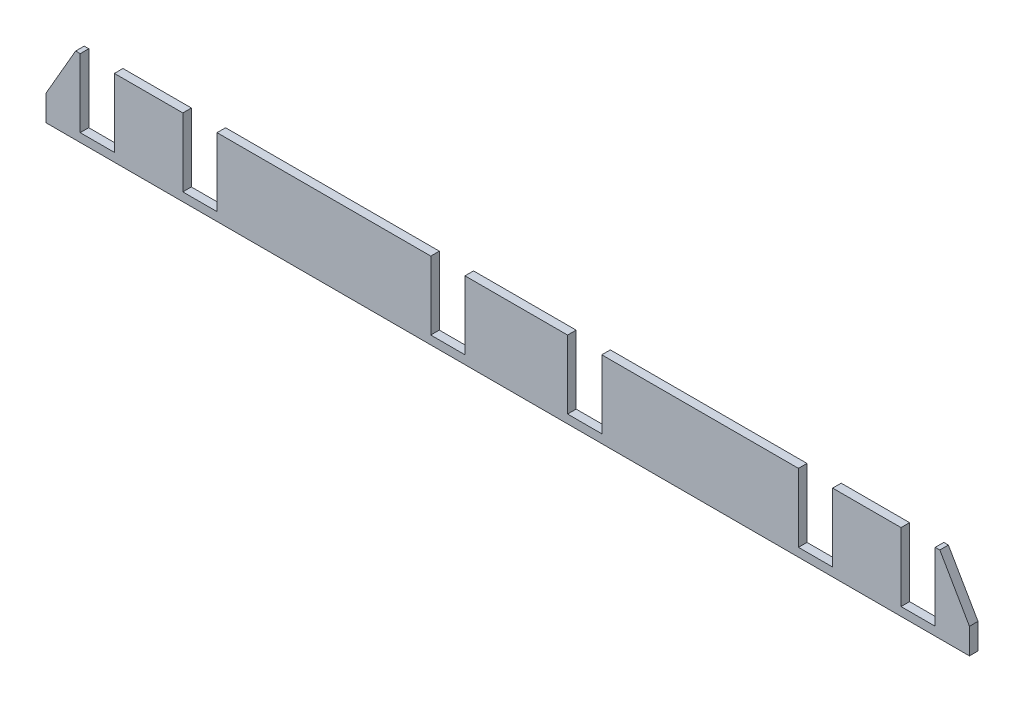
ISO-10303-21;
HEADER;
FILE_DESCRIPTION(('STEP AP214'),'2;1');
FILE_NAME('part.step','',(''),(''),'','','');
FILE_SCHEMA(('AUTOMOTIVE_DESIGN { 1 0 10303 214 1 1 1 1 }'));
ENDSEC;
DATA;
#1=APPLICATION_CONTEXT('core data for automotive mechanical design processes');
#2=APPLICATION_PROTOCOL_DEFINITION('international standard','automotive_design',2000,#1);
#3=PRODUCT_CONTEXT('',#1,'mechanical');
#4=PRODUCT('Part','Part','',(#3));
#5=PRODUCT_RELATED_PRODUCT_CATEGORY('part','',(#4));
#6=PRODUCT_DEFINITION_FORMATION('','',#4);
#7=PRODUCT_DEFINITION_CONTEXT('part definition',#1,'design');
#8=PRODUCT_DEFINITION('design','',#6,#7);
#9=PRODUCT_DEFINITION_SHAPE('','',#8);
#10=(LENGTH_UNIT() NAMED_UNIT(*) SI_UNIT(.MILLI.,.METRE.));
#11=(NAMED_UNIT(*) PLANE_ANGLE_UNIT() SI_UNIT($,.RADIAN.));
#12=(NAMED_UNIT(*) SI_UNIT($,.STERADIAN.) SOLID_ANGLE_UNIT());
#13=UNCERTAINTY_MEASURE_WITH_UNIT(LENGTH_MEASURE(1.E-05),#10,'distance_accuracy_value','');
#14=(GEOMETRIC_REPRESENTATION_CONTEXT(3) GLOBAL_UNCERTAINTY_ASSIGNED_CONTEXT((#13)) GLOBAL_UNIT_ASSIGNED_CONTEXT((#10,
#11,#12)) REPRESENTATION_CONTEXT('',''));
#15=CARTESIAN_POINT('',(0.,0.,0.));
#16=DIRECTION('',(0.,0.,1.));
#17=DIRECTION('',(1.,0.,0.));
#18=AXIS2_PLACEMENT_3D('',#15,#16,#17);
#19=CARTESIAN_POINT('',(0.,0.,10.));
#20=DIRECTION('',(1.,0.,0.));
#21=DIRECTION('',(0.,0.,-1.));
#22=AXIS2_PLACEMENT_3D('',#19,#20,#21);
#23=PLANE('',#22);
#24=DIRECTION('',(0.,-1.,0.));
#25=VECTOR('',#24,1.);
#26=CARTESIAN_POINT('',(0.,0.,10.));
#27=LINE('',#26,#25);
#28=CARTESIAN_POINT('',(0.,29.9999999999996,10.));
#29=VERTEX_POINT('',#28);
#30=CARTESIAN_POINT('',(0.,0.,10.));
#31=VERTEX_POINT('',#30);
#32=EDGE_CURVE('E228',#29,#31,#27,.T.);
#33=ORIENTED_EDGE('',*,*,#32,.F.);
#34=DIRECTION('',(0.,0.,-1.));
#35=VECTOR('',#34,1.);
#36=CARTESIAN_POINT('',(0.,29.9999999999996,10.));
#37=LINE('',#36,#35);
#38=CARTESIAN_POINT('',(0.,29.9999999999996,0.));
#39=VERTEX_POINT('',#38);
#40=EDGE_CURVE('E253',#29,#39,#37,.T.);
#41=ORIENTED_EDGE('',*,*,#40,.T.);
#42=DIRECTION('',(0.,-1.,0.));
#43=VECTOR('',#42,1.);
#44=CARTESIAN_POINT('',(0.,0.,0.));
#45=LINE('',#44,#43);
#46=CARTESIAN_POINT('',(0.,0.,0.));
#47=VERTEX_POINT('',#46);
#48=EDGE_CURVE('E251',#39,#47,#45,.T.);
#49=ORIENTED_EDGE('',*,*,#48,.T.);
#50=DIRECTION('',(0.,0.,-1.));
#51=VECTOR('',#50,1.);
#52=CARTESIAN_POINT('',(0.,0.,10.));
#53=LINE('',#52,#51);
#54=EDGE_CURVE('E245',#31,#47,#53,.T.);
#55=ORIENTED_EDGE('',*,*,#54,.F.);
#56=EDGE_LOOP('',(#33,#41,#49,#55));
#57=FACE_BOUND('',#56,.T.);
#58=ADVANCED_FACE('F33',(#57),#23,.F.);
#59=CARTESIAN_POINT('',(0.,0.,10.));
#60=DIRECTION('',(0.,1.,0.));
#61=DIRECTION('',(0.,0.,1.));
#62=AXIS2_PLACEMENT_3D('',#59,#60,#61);
#63=PLANE('',#62);
#64=DIRECTION('',(1.,0.,0.));
#65=VECTOR('',#64,1.);
#66=CARTESIAN_POINT('',(0.,0.,0.));
#67=LINE('',#66,#65);
#68=CARTESIAN_POINT('',(1080.,0.,0.));
#69=VERTEX_POINT('',#68);
#70=EDGE_CURVE('E287',#47,#69,#67,.T.);
#71=ORIENTED_EDGE('',*,*,#70,.T.);
#72=DIRECTION('',(0.,0.,-1.));
#73=VECTOR('',#72,1.);
#74=CARTESIAN_POINT('',(1080.,0.,10.));
#75=LINE('',#74,#73);
#76=CARTESIAN_POINT('',(1080.,0.,10.));
#77=VERTEX_POINT('',#76);
#78=EDGE_CURVE('E247',#77,#69,#75,.T.);
#79=ORIENTED_EDGE('',*,*,#78,.F.);
#80=DIRECTION('',(1.,0.,0.));
#81=VECTOR('',#80,1.);
#82=CARTESIAN_POINT('',(0.,0.,10.));
#83=LINE('',#82,#81);
#84=EDGE_CURVE('E232',#31,#77,#83,.T.);
#85=ORIENTED_EDGE('',*,*,#84,.F.);
#86=ORIENTED_EDGE('',*,*,#54,.T.);
#87=EDGE_LOOP('',(#71,#79,#85,#86));
#88=FACE_BOUND('',#87,.T.);
#89=ADVANCED_FACE('F244',(#88),#63,.F.);
#90=CARTESIAN_POINT('',(1080.,0.,10.));
#91=DIRECTION('',(-1.,0.,0.));
#92=DIRECTION('',(0.,0.,1.));
#93=AXIS2_PLACEMENT_3D('',#90,#91,#92);
#94=PLANE('',#93);
#95=DIRECTION('',(0.,1.,0.));
#96=VECTOR('',#95,1.);
#97=CARTESIAN_POINT('',(1080.,0.,0.));
#98=LINE('',#97,#96);
#99=CARTESIAN_POINT('',(1080.,29.9999999999995,0.));
#100=VERTEX_POINT('',#99);
#101=EDGE_CURVE('E283',#69,#100,#98,.T.);
#102=ORIENTED_EDGE('',*,*,#101,.T.);
#103=DIRECTION('',(0.,0.,1.));
#104=VECTOR('',#103,1.);
#105=CARTESIAN_POINT('',(1080.,29.9999999999995,10.));
#106=LINE('',#105,#104);
#107=CARTESIAN_POINT('',(1080.,29.9999999999995,10.));
#108=VERTEX_POINT('',#107);
#109=EDGE_CURVE('E11',#100,#108,#106,.T.);
#110=ORIENTED_EDGE('',*,*,#109,.T.);
#111=DIRECTION('',(0.,1.,0.));
#112=VECTOR('',#111,1.);
#113=CARTESIAN_POINT('',(1080.,0.,10.));
#114=LINE('',#113,#112);
#115=EDGE_CURVE('E248',#77,#108,#114,.T.);
#116=ORIENTED_EDGE('',*,*,#115,.F.);
#117=ORIENTED_EDGE('',*,*,#78,.T.);
#118=EDGE_LOOP('',(#102,#110,#116,#117));
#119=FACE_BOUND('',#118,.T.);
#120=ADVANCED_FACE('F460',(#119),#94,.F.);
#121=CARTESIAN_POINT('',(1040.,90.,10.));
#122=DIRECTION('',(0.,-1.,0.));
#123=DIRECTION('',(0.,0.,-1.));
#124=AXIS2_PLACEMENT_3D('',#121,#122,#123);
#125=PLANE('',#124);
#126=DIRECTION('',(-1.,0.,0.));
#127=VECTOR('',#126,1.);
#128=CARTESIAN_POINT('',(1040.,90.,10.));
#129=LINE('',#128,#127);
#130=CARTESIAN_POINT('',(1045.35898384862,90.,10.));
#131=VERTEX_POINT('',#130);
#132=CARTESIAN_POINT('',(1040.,90.,10.));
#133=VERTEX_POINT('',#132);
#134=EDGE_CURVE('E275',#131,#133,#129,.T.);
#135=ORIENTED_EDGE('',*,*,#134,.F.);
#136=DIRECTION('',(0.,0.,-1.));
#137=VECTOR('',#136,1.);
#138=CARTESIAN_POINT('',(1045.35898384862,90.,10.));
#139=LINE('',#138,#137);
#140=CARTESIAN_POINT('',(1045.35898384862,90.,0.));
#141=VERTEX_POINT('',#140);
#142=EDGE_CURVE('E41',#131,#141,#139,.T.);
#143=ORIENTED_EDGE('',*,*,#142,.T.);
#144=DIRECTION('',(-1.,0.,0.));
#145=VECTOR('',#144,1.);
#146=CARTESIAN_POINT('',(1040.,90.,0.));
#147=LINE('',#146,#145);
#148=CARTESIAN_POINT('',(1040.,90.,0.));
#149=VERTEX_POINT('',#148);
#150=EDGE_CURVE('E273',#141,#149,#147,.T.);
#151=ORIENTED_EDGE('',*,*,#150,.T.);
#152=DIRECTION('',(0.,0.,-1.));
#153=VECTOR('',#152,1.);
#154=CARTESIAN_POINT('',(1040.,90.,10.));
#155=LINE('',#154,#153);
#156=EDGE_CURVE('E257',#133,#149,#155,.T.);
#157=ORIENTED_EDGE('',*,*,#156,.F.);
#158=EDGE_LOOP('',(#135,#143,#151,#157));
#159=FACE_BOUND('',#158,.T.);
#160=ADVANCED_FACE('F271',(#159),#125,.F.);
#161=CARTESIAN_POINT('',(1040.,90.,10.));
#162=DIRECTION('',(1.,0.,0.));
#163=DIRECTION('',(0.,0.,-1.));
#164=AXIS2_PLACEMENT_3D('',#161,#162,#163);
#165=PLANE('',#164);
#166=DIRECTION('',(0.,-1.,0.));
#167=VECTOR('',#166,1.);
#168=CARTESIAN_POINT('',(1040.,90.,0.));
#169=LINE('',#168,#167);
#170=CARTESIAN_POINT('',(1040.,9.99999999999999,0.));
#171=VERTEX_POINT('',#170);
#172=EDGE_CURVE('E282',#149,#171,#169,.T.);
#173=ORIENTED_EDGE('',*,*,#172,.T.);
#174=DIRECTION('',(0.,0.,-1.));
#175=VECTOR('',#174,1.);
#176=CARTESIAN_POINT('',(1040.,9.99999999999999,10.));
#177=LINE('',#176,#175);
#178=CARTESIAN_POINT('',(1040.,9.99999999999999,10.));
#179=VERTEX_POINT('',#178);
#180=EDGE_CURVE('E403',#179,#171,#177,.T.);
#181=ORIENTED_EDGE('',*,*,#180,.F.);
#182=DIRECTION('',(0.,-1.,0.));
#183=VECTOR('',#182,1.);
#184=CARTESIAN_POINT('',(1040.,90.,10.));
#185=LINE('',#184,#183);
#186=EDGE_CURVE('E409',#133,#179,#185,.T.);
#187=ORIENTED_EDGE('',*,*,#186,.F.);
#188=ORIENTED_EDGE('',*,*,#156,.T.);
#189=EDGE_LOOP('',(#173,#181,#187,#188));
#190=FACE_BOUND('',#189,.T.);
#191=ADVANCED_FACE('F407',(#190),#165,.F.);
#192=CARTESIAN_POINT('',(1040.,9.99999999999999,10.));
#193=DIRECTION('',(0.,-1.,0.));
#194=DIRECTION('',(0.,0.,-1.));
#195=AXIS2_PLACEMENT_3D('',#192,#193,#194);
#196=PLANE('',#195);
#197=DIRECTION('',(-1.,0.,0.));
#198=VECTOR('',#197,1.);
#199=CARTESIAN_POINT('',(1040.,9.99999999999999,0.));
#200=LINE('',#199,#198);
#201=CARTESIAN_POINT('',(1000.,9.99999999999999,0.));
#202=VERTEX_POINT('',#201);
#203=EDGE_CURVE('E285',#171,#202,#200,.T.);
#204=ORIENTED_EDGE('',*,*,#203,.T.);
#205=DIRECTION('',(0.,0.,-1.));
#206=VECTOR('',#205,1.);
#207=CARTESIAN_POINT('',(1000.,9.99999999999999,10.));
#208=LINE('',#207,#206);
#209=CARTESIAN_POINT('',(1000.,9.99999999999999,10.));
#210=VERTEX_POINT('',#209);
#211=EDGE_CURVE('E400',#210,#202,#208,.T.);
#212=ORIENTED_EDGE('',*,*,#211,.F.);
#213=DIRECTION('',(-1.,0.,0.));
#214=VECTOR('',#213,1.);
#215=CARTESIAN_POINT('',(1040.,9.99999999999999,10.));
#216=LINE('',#215,#214);
#217=EDGE_CURVE('E411',#179,#210,#216,.T.);
#218=ORIENTED_EDGE('',*,*,#217,.F.);
#219=ORIENTED_EDGE('',*,*,#180,.T.);
#220=EDGE_LOOP('',(#204,#212,#218,#219));
#221=FACE_BOUND('',#220,.T.);
#222=ADVANCED_FACE('F480',(#221),#196,.F.);
#223=CARTESIAN_POINT('',(1000.,90.,10.));
#224=DIRECTION('',(-1.,0.,0.));
#225=DIRECTION('',(0.,0.,1.));
#226=AXIS2_PLACEMENT_3D('',#223,#224,#225);
#227=PLANE('',#226);
#228=DIRECTION('',(0.,1.,0.));
#229=VECTOR('',#228,1.);
#230=CARTESIAN_POINT('',(1000.,90.,0.));
#231=LINE('',#230,#229);
#232=CARTESIAN_POINT('',(1000.,90.,0.));
#233=VERTEX_POINT('',#232);
#234=EDGE_CURVE('E292',#202,#233,#231,.T.);
#235=ORIENTED_EDGE('',*,*,#234,.T.);
#236=DIRECTION('',(0.,0.,-1.));
#237=VECTOR('',#236,1.);
#238=CARTESIAN_POINT('',(1000.,90.,10.));
#239=LINE('',#238,#237);
#240=CARTESIAN_POINT('',(1000.,90.,10.));
#241=VERTEX_POINT('',#240);
#242=EDGE_CURVE('E397',#241,#233,#239,.T.);
#243=ORIENTED_EDGE('',*,*,#242,.F.);
#244=DIRECTION('',(0.,1.,0.));
#245=VECTOR('',#244,1.);
#246=CARTESIAN_POINT('',(1000.,90.,10.));
#247=LINE('',#246,#245);
#248=EDGE_CURVE('E413',#210,#241,#247,.T.);
#249=ORIENTED_EDGE('',*,*,#248,.F.);
#250=ORIENTED_EDGE('',*,*,#211,.T.);
#251=EDGE_LOOP('',(#235,#243,#249,#250));
#252=FACE_BOUND('',#251,.T.);
#253=ADVANCED_FACE('F483',(#252),#227,.F.);
#254=CARTESIAN_POINT('',(920.,90.,10.));
#255=DIRECTION('',(0.,-1.,0.));
#256=DIRECTION('',(0.,0.,-1.));
#257=AXIS2_PLACEMENT_3D('',#254,#255,#256);
#258=PLANE('',#257);
#259=DIRECTION('',(-1.,0.,0.));
#260=VECTOR('',#259,1.);
#261=CARTESIAN_POINT('',(920.,90.,0.));
#262=LINE('',#261,#260);
#263=CARTESIAN_POINT('',(920.,90.,0.));
#264=VERTEX_POINT('',#263);
#265=EDGE_CURVE('E294',#233,#264,#262,.T.);
#266=ORIENTED_EDGE('',*,*,#265,.T.);
#267=DIRECTION('',(0.,0.,-1.));
#268=VECTOR('',#267,1.);
#269=CARTESIAN_POINT('',(920.,90.,10.));
#270=LINE('',#269,#268);
#271=CARTESIAN_POINT('',(920.,90.,10.));
#272=VERTEX_POINT('',#271);
#273=EDGE_CURVE('E394',#272,#264,#270,.T.);
#274=ORIENTED_EDGE('',*,*,#273,.F.);
#275=DIRECTION('',(-1.,0.,0.));
#276=VECTOR('',#275,1.);
#277=CARTESIAN_POINT('',(920.,90.,10.));
#278=LINE('',#277,#276);
#279=EDGE_CURVE('E419',#241,#272,#278,.T.);
#280=ORIENTED_EDGE('',*,*,#279,.F.);
#281=ORIENTED_EDGE('',*,*,#242,.T.);
#282=EDGE_LOOP('',(#266,#274,#280,#281));
#283=FACE_BOUND('',#282,.T.);
#284=ADVANCED_FACE('F487',(#283),#258,.F.);
#285=CARTESIAN_POINT('',(920.,90.,10.));
#286=DIRECTION('',(1.,0.,0.));
#287=DIRECTION('',(0.,0.,-1.));
#288=AXIS2_PLACEMENT_3D('',#285,#286,#287);
#289=PLANE('',#288);
#290=DIRECTION('',(0.,-1.,0.));
#291=VECTOR('',#290,1.);
#292=CARTESIAN_POINT('',(920.,90.,0.));
#293=LINE('',#292,#291);
#294=CARTESIAN_POINT('',(920.,9.99999999999999,0.));
#295=VERTEX_POINT('',#294);
#296=EDGE_CURVE('E296',#264,#295,#293,.T.);
#297=ORIENTED_EDGE('',*,*,#296,.T.);
#298=DIRECTION('',(0.,0.,-1.));
#299=VECTOR('',#298,1.);
#300=CARTESIAN_POINT('',(920.,9.99999999999999,10.));
#301=LINE('',#300,#299);
#302=CARTESIAN_POINT('',(920.,9.99999999999999,10.));
#303=VERTEX_POINT('',#302);
#304=EDGE_CURVE('E391',#303,#295,#301,.T.);
#305=ORIENTED_EDGE('',*,*,#304,.F.);
#306=DIRECTION('',(0.,-1.,0.));
#307=VECTOR('',#306,1.);
#308=CARTESIAN_POINT('',(920.,90.,10.));
#309=LINE('',#308,#307);
#310=EDGE_CURVE('E421',#272,#303,#309,.T.);
#311=ORIENTED_EDGE('',*,*,#310,.F.);
#312=ORIENTED_EDGE('',*,*,#273,.T.);
#313=EDGE_LOOP('',(#297,#305,#311,#312));
#314=FACE_BOUND('',#313,.T.);
#315=ADVANCED_FACE('F491',(#314),#289,.F.);
#316=CARTESIAN_POINT('',(920.,9.99999999999999,10.));
#317=DIRECTION('',(0.,-1.,0.));
#318=DIRECTION('',(0.,0.,-1.));
#319=AXIS2_PLACEMENT_3D('',#316,#317,#318);
#320=PLANE('',#319);
#321=DIRECTION('',(-1.,0.,0.));
#322=VECTOR('',#321,1.);
#323=CARTESIAN_POINT('',(920.,9.99999999999999,0.));
#324=LINE('',#323,#322);
#325=CARTESIAN_POINT('',(880.,9.99999999999999,0.));
#326=VERTEX_POINT('',#325);
#327=EDGE_CURVE('E298',#295,#326,#324,.T.);
#328=ORIENTED_EDGE('',*,*,#327,.T.);
#329=DIRECTION('',(0.,0.,-1.));
#330=VECTOR('',#329,1.);
#331=CARTESIAN_POINT('',(880.,9.99999999999999,10.));
#332=LINE('',#331,#330);
#333=CARTESIAN_POINT('',(880.,9.99999999999999,10.));
#334=VERTEX_POINT('',#333);
#335=EDGE_CURVE('E388',#334,#326,#332,.T.);
#336=ORIENTED_EDGE('',*,*,#335,.F.);
#337=DIRECTION('',(-1.,0.,0.));
#338=VECTOR('',#337,1.);
#339=CARTESIAN_POINT('',(920.,9.99999999999999,10.));
#340=LINE('',#339,#338);
#341=EDGE_CURVE('E423',#303,#334,#340,.T.);
#342=ORIENTED_EDGE('',*,*,#341,.F.);
#343=ORIENTED_EDGE('',*,*,#304,.T.);
#344=EDGE_LOOP('',(#328,#336,#342,#343));
#345=FACE_BOUND('',#344,.T.);
#346=ADVANCED_FACE('F495',(#345),#320,.F.);
#347=CARTESIAN_POINT('',(880.,90.,10.));
#348=DIRECTION('',(-1.,0.,0.));
#349=DIRECTION('',(0.,0.,1.));
#350=AXIS2_PLACEMENT_3D('',#347,#348,#349);
#351=PLANE('',#350);
#352=DIRECTION('',(0.,1.,0.));
#353=VECTOR('',#352,1.);
#354=CARTESIAN_POINT('',(880.,90.,0.));
#355=LINE('',#354,#353);
#356=CARTESIAN_POINT('',(880.,90.,0.));
#357=VERTEX_POINT('',#356);
#358=EDGE_CURVE('E300',#326,#357,#355,.T.);
#359=ORIENTED_EDGE('',*,*,#358,.T.);
#360=DIRECTION('',(0.,0.,-1.));
#361=VECTOR('',#360,1.);
#362=CARTESIAN_POINT('',(880.,90.,10.));
#363=LINE('',#362,#361);
#364=CARTESIAN_POINT('',(880.,90.,10.));
#365=VERTEX_POINT('',#364);
#366=EDGE_CURVE('E385',#365,#357,#363,.T.);
#367=ORIENTED_EDGE('',*,*,#366,.F.);
#368=DIRECTION('',(0.,1.,0.));
#369=VECTOR('',#368,1.);
#370=CARTESIAN_POINT('',(880.,90.,10.));
#371=LINE('',#370,#369);
#372=EDGE_CURVE('E425',#334,#365,#371,.T.);
#373=ORIENTED_EDGE('',*,*,#372,.F.);
#374=ORIENTED_EDGE('',*,*,#335,.T.);
#375=EDGE_LOOP('',(#359,#367,#373,#374));
#376=FACE_BOUND('',#375,.T.);
#377=ADVANCED_FACE('F499',(#376),#351,.F.);
#378=CARTESIAN_POINT('',(880.,90.,10.));
#379=DIRECTION('',(0.,-1.,0.));
#380=DIRECTION('',(0.,0.,-1.));
#381=AXIS2_PLACEMENT_3D('',#378,#379,#380);
#382=PLANE('',#381);
#383=DIRECTION('',(-1.,0.,0.));
#384=VECTOR('',#383,1.);
#385=CARTESIAN_POINT('',(880.,90.,0.));
#386=LINE('',#385,#384);
#387=CARTESIAN_POINT('',(650.,90.,0.));
#388=VERTEX_POINT('',#387);
#389=EDGE_CURVE('E302',#357,#388,#386,.T.);
#390=ORIENTED_EDGE('',*,*,#389,.T.);
#391=DIRECTION('',(0.,0.,-1.));
#392=VECTOR('',#391,1.);
#393=CARTESIAN_POINT('',(650.,90.,10.));
#394=LINE('',#393,#392);
#395=CARTESIAN_POINT('',(650.,90.,10.));
#396=VERTEX_POINT('',#395);
#397=EDGE_CURVE('E382',#396,#388,#394,.T.);
#398=ORIENTED_EDGE('',*,*,#397,.F.);
#399=DIRECTION('',(-1.,0.,0.));
#400=VECTOR('',#399,1.);
#401=CARTESIAN_POINT('',(880.,90.,10.));
#402=LINE('',#401,#400);
#403=EDGE_CURVE('E427',#365,#396,#402,.T.);
#404=ORIENTED_EDGE('',*,*,#403,.F.);
#405=ORIENTED_EDGE('',*,*,#366,.T.);
#406=EDGE_LOOP('',(#390,#398,#404,#405));
#407=FACE_BOUND('',#406,.T.);
#408=ADVANCED_FACE('F503',(#407),#382,.F.);
#409=CARTESIAN_POINT('',(650.,90.,10.));
#410=DIRECTION('',(1.,0.,0.));
#411=DIRECTION('',(0.,0.,-1.));
#412=AXIS2_PLACEMENT_3D('',#409,#410,#411);
#413=PLANE('',#412);
#414=DIRECTION('',(0.,-1.,0.));
#415=VECTOR('',#414,1.);
#416=CARTESIAN_POINT('',(650.,90.,0.));
#417=LINE('',#416,#415);
#418=CARTESIAN_POINT('',(650.,9.99999999999999,0.));
#419=VERTEX_POINT('',#418);
#420=EDGE_CURVE('E304',#388,#419,#417,.T.);
#421=ORIENTED_EDGE('',*,*,#420,.T.);
#422=DIRECTION('',(0.,0.,-1.));
#423=VECTOR('',#422,1.);
#424=CARTESIAN_POINT('',(650.,9.99999999999999,10.));
#425=LINE('',#424,#423);
#426=CARTESIAN_POINT('',(650.,9.99999999999999,10.));
#427=VERTEX_POINT('',#426);
#428=EDGE_CURVE('E379',#427,#419,#425,.T.);
#429=ORIENTED_EDGE('',*,*,#428,.F.);
#430=DIRECTION('',(0.,-1.,0.));
#431=VECTOR('',#430,1.);
#432=CARTESIAN_POINT('',(650.,90.,10.));
#433=LINE('',#432,#431);
#434=EDGE_CURVE('E429',#396,#427,#433,.T.);
#435=ORIENTED_EDGE('',*,*,#434,.F.);
#436=ORIENTED_EDGE('',*,*,#397,.T.);
#437=EDGE_LOOP('',(#421,#429,#435,#436));
#438=FACE_BOUND('',#437,.T.);
#439=ADVANCED_FACE('F507',(#438),#413,.F.);
#440=CARTESIAN_POINT('',(610.,9.99999999999999,10.));
#441=DIRECTION('',(0.,-1.,0.));
#442=DIRECTION('',(0.,0.,-1.));
#443=AXIS2_PLACEMENT_3D('',#440,#441,#442);
#444=PLANE('',#443);
#445=DIRECTION('',(-1.,0.,0.));
#446=VECTOR('',#445,1.);
#447=CARTESIAN_POINT('',(610.,9.99999999999999,0.));
#448=LINE('',#447,#446);
#449=CARTESIAN_POINT('',(610.,9.99999999999999,0.));
#450=VERTEX_POINT('',#449);
#451=EDGE_CURVE('E306',#419,#450,#448,.T.);
#452=ORIENTED_EDGE('',*,*,#451,.T.);
#453=DIRECTION('',(0.,0.,-1.));
#454=VECTOR('',#453,1.);
#455=CARTESIAN_POINT('',(610.,9.99999999999999,10.));
#456=LINE('',#455,#454);
#457=CARTESIAN_POINT('',(610.,9.99999999999999,10.));
#458=VERTEX_POINT('',#457);
#459=EDGE_CURVE('E376',#458,#450,#456,.T.);
#460=ORIENTED_EDGE('',*,*,#459,.F.);
#461=DIRECTION('',(-1.,0.,0.));
#462=VECTOR('',#461,1.);
#463=CARTESIAN_POINT('',(610.,9.99999999999999,10.));
#464=LINE('',#463,#462);
#465=EDGE_CURVE('E431',#427,#458,#464,.T.);
#466=ORIENTED_EDGE('',*,*,#465,.F.);
#467=ORIENTED_EDGE('',*,*,#428,.T.);
#468=EDGE_LOOP('',(#452,#460,#466,#467));
#469=FACE_BOUND('',#468,.T.);
#470=ADVANCED_FACE('F511',(#469),#444,.F.);
#471=CARTESIAN_POINT('',(610.,90.,10.));
#472=DIRECTION('',(-1.,0.,0.));
#473=DIRECTION('',(0.,0.,1.));
#474=AXIS2_PLACEMENT_3D('',#471,#472,#473);
#475=PLANE('',#474);
#476=DIRECTION('',(0.,1.,0.));
#477=VECTOR('',#476,1.);
#478=CARTESIAN_POINT('',(610.,90.,0.));
#479=LINE('',#478,#477);
#480=CARTESIAN_POINT('',(610.,90.,0.));
#481=VERTEX_POINT('',#480);
#482=EDGE_CURVE('E308',#450,#481,#479,.T.);
#483=ORIENTED_EDGE('',*,*,#482,.T.);
#484=DIRECTION('',(0.,0.,-1.));
#485=VECTOR('',#484,1.);
#486=CARTESIAN_POINT('',(610.,90.,10.));
#487=LINE('',#486,#485);
#488=CARTESIAN_POINT('',(610.,90.,10.));
#489=VERTEX_POINT('',#488);
#490=EDGE_CURVE('E373',#489,#481,#487,.T.);
#491=ORIENTED_EDGE('',*,*,#490,.F.);
#492=DIRECTION('',(0.,1.,0.));
#493=VECTOR('',#492,1.);
#494=CARTESIAN_POINT('',(610.,90.,10.));
#495=LINE('',#494,#493);
#496=EDGE_CURVE('E433',#458,#489,#495,.T.);
#497=ORIENTED_EDGE('',*,*,#496,.F.);
#498=ORIENTED_EDGE('',*,*,#459,.T.);
#499=EDGE_LOOP('',(#483,#491,#497,#498));
#500=FACE_BOUND('',#499,.T.);
#501=ADVANCED_FACE('F515',(#500),#475,.F.);
#502=CARTESIAN_POINT('',(490.,90.,10.));
#503=DIRECTION('',(0.,-1.,0.));
#504=DIRECTION('',(0.,0.,-1.));
#505=AXIS2_PLACEMENT_3D('',#502,#503,#504);
#506=PLANE('',#505);
#507=DIRECTION('',(-1.,0.,0.));
#508=VECTOR('',#507,1.);
#509=CARTESIAN_POINT('',(490.,90.,0.));
#510=LINE('',#509,#508);
#511=CARTESIAN_POINT('',(490.,90.,0.));
#512=VERTEX_POINT('',#511);
#513=EDGE_CURVE('E310',#481,#512,#510,.T.);
#514=ORIENTED_EDGE('',*,*,#513,.T.);
#515=DIRECTION('',(0.,0.,-1.));
#516=VECTOR('',#515,1.);
#517=CARTESIAN_POINT('',(490.,90.,10.));
#518=LINE('',#517,#516);
#519=CARTESIAN_POINT('',(490.,90.,10.));
#520=VERTEX_POINT('',#519);
#521=EDGE_CURVE('E370',#520,#512,#518,.T.);
#522=ORIENTED_EDGE('',*,*,#521,.F.);
#523=DIRECTION('',(-1.,0.,0.));
#524=VECTOR('',#523,1.);
#525=CARTESIAN_POINT('',(490.,90.,10.));
#526=LINE('',#525,#524);
#527=EDGE_CURVE('E435',#489,#520,#526,.T.);
#528=ORIENTED_EDGE('',*,*,#527,.F.);
#529=ORIENTED_EDGE('',*,*,#490,.T.);
#530=EDGE_LOOP('',(#514,#522,#528,#529));
#531=FACE_BOUND('',#530,.T.);
#532=ADVANCED_FACE('F519',(#531),#506,.F.);
#533=CARTESIAN_POINT('',(490.,90.,10.));
#534=DIRECTION('',(1.,0.,0.));
#535=DIRECTION('',(0.,0.,-1.));
#536=AXIS2_PLACEMENT_3D('',#533,#534,#535);
#537=PLANE('',#536);
#538=DIRECTION('',(0.,-1.,0.));
#539=VECTOR('',#538,1.);
#540=CARTESIAN_POINT('',(490.,90.,0.));
#541=LINE('',#540,#539);
#542=CARTESIAN_POINT('',(490.,9.99999999999999,0.));
#543=VERTEX_POINT('',#542);
#544=EDGE_CURVE('E312',#512,#543,#541,.T.);
#545=ORIENTED_EDGE('',*,*,#544,.T.);
#546=DIRECTION('',(0.,0.,-1.));
#547=VECTOR('',#546,1.);
#548=CARTESIAN_POINT('',(490.,9.99999999999999,10.));
#549=LINE('',#548,#547);
#550=CARTESIAN_POINT('',(490.,9.99999999999999,10.));
#551=VERTEX_POINT('',#550);
#552=EDGE_CURVE('E367',#551,#543,#549,.T.);
#553=ORIENTED_EDGE('',*,*,#552,.F.);
#554=DIRECTION('',(0.,-1.,0.));
#555=VECTOR('',#554,1.);
#556=CARTESIAN_POINT('',(490.,90.,10.));
#557=LINE('',#556,#555);
#558=EDGE_CURVE('E437',#520,#551,#557,.T.);
#559=ORIENTED_EDGE('',*,*,#558,.F.);
#560=ORIENTED_EDGE('',*,*,#521,.T.);
#561=EDGE_LOOP('',(#545,#553,#559,#560));
#562=FACE_BOUND('',#561,.T.);
#563=ADVANCED_FACE('F523',(#562),#537,.F.);
#564=CARTESIAN_POINT('',(450.,9.99999999999999,10.));
#565=DIRECTION('',(0.,-1.,0.));
#566=DIRECTION('',(1.,0.,0.));
#567=AXIS2_PLACEMENT_3D('',#564,#565,#566);
#568=PLANE('',#567);
#569=DIRECTION('',(-1.,0.,0.));
#570=VECTOR('',#569,1.);
#571=CARTESIAN_POINT('',(450.,9.99999999999999,0.));
#572=LINE('',#571,#570);
#573=CARTESIAN_POINT('',(450.,9.99999999999999,0.));
#574=VERTEX_POINT('',#573);
#575=EDGE_CURVE('E314',#543,#574,#572,.T.);
#576=ORIENTED_EDGE('',*,*,#575,.T.);
#577=DIRECTION('',(0.,0.,-1.));
#578=VECTOR('',#577,1.);
#579=CARTESIAN_POINT('',(450.,9.99999999999999,10.));
#580=LINE('',#579,#578);
#581=CARTESIAN_POINT('',(450.,9.99999999999999,10.));
#582=VERTEX_POINT('',#581);
#583=EDGE_CURVE('E364',#582,#574,#580,.T.);
#584=ORIENTED_EDGE('',*,*,#583,.F.);
#585=DIRECTION('',(-1.,0.,0.));
#586=VECTOR('',#585,1.);
#587=CARTESIAN_POINT('',(450.,9.99999999999999,10.));
#588=LINE('',#587,#586);
#589=EDGE_CURVE('E439',#551,#582,#588,.T.);
#590=ORIENTED_EDGE('',*,*,#589,.F.);
#591=ORIENTED_EDGE('',*,*,#552,.T.);
#592=EDGE_LOOP('',(#576,#584,#590,#591));
#593=FACE_BOUND('',#592,.T.);
#594=ADVANCED_FACE('F527',(#593),#568,.F.);
#595=CARTESIAN_POINT('',(450.,90.,10.));
#596=DIRECTION('',(-1.,0.,0.));
#597=DIRECTION('',(0.,0.,1.));
#598=AXIS2_PLACEMENT_3D('',#595,#596,#597);
#599=PLANE('',#598);
#600=DIRECTION('',(0.,1.,0.));
#601=VECTOR('',#600,1.);
#602=CARTESIAN_POINT('',(450.,90.,0.));
#603=LINE('',#602,#601);
#604=CARTESIAN_POINT('',(450.,90.,0.));
#605=VERTEX_POINT('',#604);
#606=EDGE_CURVE('E316',#574,#605,#603,.T.);
#607=ORIENTED_EDGE('',*,*,#606,.T.);
#608=DIRECTION('',(0.,0.,-1.));
#609=VECTOR('',#608,1.);
#610=CARTESIAN_POINT('',(450.,90.,10.));
#611=LINE('',#610,#609);
#612=CARTESIAN_POINT('',(450.,90.,10.));
#613=VERTEX_POINT('',#612);
#614=EDGE_CURVE('E361',#613,#605,#611,.T.);
#615=ORIENTED_EDGE('',*,*,#614,.F.);
#616=DIRECTION('',(0.,1.,0.));
#617=VECTOR('',#616,1.);
#618=CARTESIAN_POINT('',(450.,90.,10.));
#619=LINE('',#618,#617);
#620=EDGE_CURVE('E441',#582,#613,#619,.T.);
#621=ORIENTED_EDGE('',*,*,#620,.F.);
#622=ORIENTED_EDGE('',*,*,#583,.T.);
#623=EDGE_LOOP('',(#607,#615,#621,#622));
#624=FACE_BOUND('',#623,.T.);
#625=ADVANCED_FACE('F531',(#624),#599,.F.);
#626=CARTESIAN_POINT('',(450.,90.,10.));
#627=DIRECTION('',(0.,-1.,0.));
#628=DIRECTION('',(1.,0.,0.));
#629=AXIS2_PLACEMENT_3D('',#626,#627,#628);
#630=PLANE('',#629);
#631=DIRECTION('',(-1.,0.,0.));
#632=VECTOR('',#631,1.);
#633=CARTESIAN_POINT('',(450.,90.,0.));
#634=LINE('',#633,#632);
#635=CARTESIAN_POINT('',(200.,90.,0.));
#636=VERTEX_POINT('',#635);
#637=EDGE_CURVE('E318',#605,#636,#634,.T.);
#638=ORIENTED_EDGE('',*,*,#637,.T.);
#639=DIRECTION('',(0.,0.,-1.));
#640=VECTOR('',#639,1.);
#641=CARTESIAN_POINT('',(200.,90.,10.));
#642=LINE('',#641,#640);
#643=CARTESIAN_POINT('',(200.,90.,10.));
#644=VERTEX_POINT('',#643);
#645=EDGE_CURVE('E358',#644,#636,#642,.T.);
#646=ORIENTED_EDGE('',*,*,#645,.F.);
#647=DIRECTION('',(-1.,0.,0.));
#648=VECTOR('',#647,1.);
#649=CARTESIAN_POINT('',(450.,90.,10.));
#650=LINE('',#649,#648);
#651=EDGE_CURVE('E443',#613,#644,#650,.T.);
#652=ORIENTED_EDGE('',*,*,#651,.F.);
#653=ORIENTED_EDGE('',*,*,#614,.T.);
#654=EDGE_LOOP('',(#638,#646,#652,#653));
#655=FACE_BOUND('',#654,.T.);
#656=ADVANCED_FACE('F535',(#655),#630,.F.);
#657=CARTESIAN_POINT('',(200.,90.,10.));
#658=DIRECTION('',(1.,0.,0.));
#659=DIRECTION('',(0.,0.,-1.));
#660=AXIS2_PLACEMENT_3D('',#657,#658,#659);
#661=PLANE('',#660);
#662=DIRECTION('',(0.,-1.,0.));
#663=VECTOR('',#662,1.);
#664=CARTESIAN_POINT('',(200.,90.,0.));
#665=LINE('',#664,#663);
#666=CARTESIAN_POINT('',(200.,9.99999999999999,0.));
#667=VERTEX_POINT('',#666);
#668=EDGE_CURVE('E320',#636,#667,#665,.T.);
#669=ORIENTED_EDGE('',*,*,#668,.T.);
#670=DIRECTION('',(0.,0.,-1.));
#671=VECTOR('',#670,1.);
#672=CARTESIAN_POINT('',(200.,9.99999999999999,10.));
#673=LINE('',#672,#671);
#674=CARTESIAN_POINT('',(200.,9.99999999999999,10.));
#675=VERTEX_POINT('',#674);
#676=EDGE_CURVE('E355',#675,#667,#673,.T.);
#677=ORIENTED_EDGE('',*,*,#676,.F.);
#678=DIRECTION('',(0.,-1.,0.));
#679=VECTOR('',#678,1.);
#680=CARTESIAN_POINT('',(200.,90.,10.));
#681=LINE('',#680,#679);
#682=EDGE_CURVE('E445',#644,#675,#681,.T.);
#683=ORIENTED_EDGE('',*,*,#682,.F.);
#684=ORIENTED_EDGE('',*,*,#645,.T.);
#685=EDGE_LOOP('',(#669,#677,#683,#684));
#686=FACE_BOUND('',#685,.T.);
#687=ADVANCED_FACE('F539',(#686),#661,.F.);
#688=CARTESIAN_POINT('',(160.,9.99999999999999,10.));
#689=DIRECTION('',(0.,-1.,0.));
#690=DIRECTION('',(0.,0.,-1.));
#691=AXIS2_PLACEMENT_3D('',#688,#689,#690);
#692=PLANE('',#691);
#693=DIRECTION('',(-1.,0.,0.));
#694=VECTOR('',#693,1.);
#695=CARTESIAN_POINT('',(160.,9.99999999999999,0.));
#696=LINE('',#695,#694);
#697=CARTESIAN_POINT('',(160.,9.99999999999999,0.));
#698=VERTEX_POINT('',#697);
#699=EDGE_CURVE('E322',#667,#698,#696,.T.);
#700=ORIENTED_EDGE('',*,*,#699,.T.);
#701=DIRECTION('',(0.,0.,-1.));
#702=VECTOR('',#701,1.);
#703=CARTESIAN_POINT('',(160.,9.99999999999999,10.));
#704=LINE('',#703,#702);
#705=CARTESIAN_POINT('',(160.,9.99999999999999,10.));
#706=VERTEX_POINT('',#705);
#707=EDGE_CURVE('E352',#706,#698,#704,.T.);
#708=ORIENTED_EDGE('',*,*,#707,.F.);
#709=DIRECTION('',(-1.,0.,0.));
#710=VECTOR('',#709,1.);
#711=CARTESIAN_POINT('',(160.,9.99999999999999,10.));
#712=LINE('',#711,#710);
#713=EDGE_CURVE('E447',#675,#706,#712,.T.);
#714=ORIENTED_EDGE('',*,*,#713,.F.);
#715=ORIENTED_EDGE('',*,*,#676,.T.);
#716=EDGE_LOOP('',(#700,#708,#714,#715));
#717=FACE_BOUND('',#716,.T.);
#718=ADVANCED_FACE('F543',(#717),#692,.F.);
#719=CARTESIAN_POINT('',(160.,90.,10.));
#720=DIRECTION('',(-1.,0.,0.));
#721=DIRECTION('',(0.,0.,1.));
#722=AXIS2_PLACEMENT_3D('',#719,#720,#721);
#723=PLANE('',#722);
#724=DIRECTION('',(0.,1.,0.));
#725=VECTOR('',#724,1.);
#726=CARTESIAN_POINT('',(160.,90.,0.));
#727=LINE('',#726,#725);
#728=CARTESIAN_POINT('',(160.,90.,0.));
#729=VERTEX_POINT('',#728);
#730=EDGE_CURVE('E324',#698,#729,#727,.T.);
#731=ORIENTED_EDGE('',*,*,#730,.T.);
#732=DIRECTION('',(0.,0.,-1.));
#733=VECTOR('',#732,1.);
#734=CARTESIAN_POINT('',(160.,90.,10.));
#735=LINE('',#734,#733);
#736=CARTESIAN_POINT('',(160.,90.,10.));
#737=VERTEX_POINT('',#736);
#738=EDGE_CURVE('E349',#737,#729,#735,.T.);
#739=ORIENTED_EDGE('',*,*,#738,.F.);
#740=DIRECTION('',(0.,1.,0.));
#741=VECTOR('',#740,1.);
#742=CARTESIAN_POINT('',(160.,90.,10.));
#743=LINE('',#742,#741);
#744=EDGE_CURVE('E449',#706,#737,#743,.T.);
#745=ORIENTED_EDGE('',*,*,#744,.F.);
#746=ORIENTED_EDGE('',*,*,#707,.T.);
#747=EDGE_LOOP('',(#731,#739,#745,#746));
#748=FACE_BOUND('',#747,.T.);
#749=ADVANCED_FACE('F547',(#748),#723,.F.);
#750=CARTESIAN_POINT('',(80.0000000000001,90.,10.));
#751=DIRECTION('',(0.,-1.,0.));
#752=DIRECTION('',(0.,0.,-1.));
#753=AXIS2_PLACEMENT_3D('',#750,#751,#752);
#754=PLANE('',#753);
#755=DIRECTION('',(-1.,0.,0.));
#756=VECTOR('',#755,1.);
#757=CARTESIAN_POINT('',(80.0000000000001,90.,0.));
#758=LINE('',#757,#756);
#759=CARTESIAN_POINT('',(80.0000000000001,90.,0.));
#760=VERTEX_POINT('',#759);
#761=EDGE_CURVE('E326',#729,#760,#758,.T.);
#762=ORIENTED_EDGE('',*,*,#761,.T.);
#763=DIRECTION('',(0.,0.,-1.));
#764=VECTOR('',#763,1.);
#765=CARTESIAN_POINT('',(80.0000000000001,90.,10.));
#766=LINE('',#765,#764);
#767=CARTESIAN_POINT('',(80.0000000000001,90.,10.));
#768=VERTEX_POINT('',#767);
#769=EDGE_CURVE('E346',#768,#760,#766,.T.);
#770=ORIENTED_EDGE('',*,*,#769,.F.);
#771=DIRECTION('',(-1.,0.,0.));
#772=VECTOR('',#771,1.);
#773=CARTESIAN_POINT('',(80.0000000000001,90.,10.));
#774=LINE('',#773,#772);
#775=EDGE_CURVE('E451',#737,#768,#774,.T.);
#776=ORIENTED_EDGE('',*,*,#775,.F.);
#777=ORIENTED_EDGE('',*,*,#738,.T.);
#778=EDGE_LOOP('',(#762,#770,#776,#777));
#779=FACE_BOUND('',#778,.T.);
#780=ADVANCED_FACE('F551',(#779),#754,.F.);
#781=CARTESIAN_POINT('',(80.0000000000001,90.,10.));
#782=DIRECTION('',(1.,0.,0.));
#783=DIRECTION('',(0.,0.,-1.));
#784=AXIS2_PLACEMENT_3D('',#781,#782,#783);
#785=PLANE('',#784);
#786=DIRECTION('',(0.,-1.,0.));
#787=VECTOR('',#786,1.);
#788=CARTESIAN_POINT('',(80.0000000000001,90.,0.));
#789=LINE('',#788,#787);
#790=CARTESIAN_POINT('',(80.0000000000001,9.99999999999999,0.));
#791=VERTEX_POINT('',#790);
#792=EDGE_CURVE('E328',#760,#791,#789,.T.);
#793=ORIENTED_EDGE('',*,*,#792,.T.);
#794=DIRECTION('',(0.,0.,-1.));
#795=VECTOR('',#794,1.);
#796=CARTESIAN_POINT('',(80.0000000000001,9.99999999999999,10.));
#797=LINE('',#796,#795);
#798=CARTESIAN_POINT('',(80.0000000000001,9.99999999999999,10.));
#799=VERTEX_POINT('',#798);
#800=EDGE_CURVE('E343',#799,#791,#797,.T.);
#801=ORIENTED_EDGE('',*,*,#800,.F.);
#802=DIRECTION('',(0.,-1.,0.));
#803=VECTOR('',#802,1.);
#804=CARTESIAN_POINT('',(80.0000000000001,90.,10.));
#805=LINE('',#804,#803);
#806=EDGE_CURVE('E453',#768,#799,#805,.T.);
#807=ORIENTED_EDGE('',*,*,#806,.F.);
#808=ORIENTED_EDGE('',*,*,#769,.T.);
#809=EDGE_LOOP('',(#793,#801,#807,#808));
#810=FACE_BOUND('',#809,.T.);
#811=ADVANCED_FACE('F555',(#810),#785,.F.);
#812=CARTESIAN_POINT('',(40.0000000000003,9.99999999999999,10.));
#813=DIRECTION('',(0.,-1.,0.));
#814=DIRECTION('',(0.,0.,-1.));
#815=AXIS2_PLACEMENT_3D('',#812,#813,#814);
#816=PLANE('',#815);
#817=DIRECTION('',(-1.,0.,0.));
#818=VECTOR('',#817,1.);
#819=CARTESIAN_POINT('',(40.0000000000003,9.99999999999999,0.));
#820=LINE('',#819,#818);
#821=CARTESIAN_POINT('',(40.0000000000003,9.99999999999999,0.));
#822=VERTEX_POINT('',#821);
#823=EDGE_CURVE('E330',#791,#822,#820,.T.);
#824=ORIENTED_EDGE('',*,*,#823,.T.);
#825=DIRECTION('',(0.,0.,-1.));
#826=VECTOR('',#825,1.);
#827=CARTESIAN_POINT('',(40.0000000000003,9.99999999999999,10.));
#828=LINE('',#827,#826);
#829=CARTESIAN_POINT('',(40.0000000000003,9.99999999999999,10.));
#830=VERTEX_POINT('',#829);
#831=EDGE_CURVE('E339',#830,#822,#828,.T.);
#832=ORIENTED_EDGE('',*,*,#831,.F.);
#833=DIRECTION('',(-1.,0.,0.));
#834=VECTOR('',#833,1.);
#835=CARTESIAN_POINT('',(40.0000000000003,9.99999999999999,10.));
#836=LINE('',#835,#834);
#837=EDGE_CURVE('E455',#799,#830,#836,.T.);
#838=ORIENTED_EDGE('',*,*,#837,.F.);
#839=ORIENTED_EDGE('',*,*,#800,.T.);
#840=EDGE_LOOP('',(#824,#832,#838,#839));
#841=FACE_BOUND('',#840,.T.);
#842=ADVANCED_FACE('F559',(#841),#816,.F.);
#843=CARTESIAN_POINT('',(40.0000000000003,90.,10.));
#844=DIRECTION('',(-1.,0.,0.));
#845=DIRECTION('',(0.,0.,1.));
#846=AXIS2_PLACEMENT_3D('',#843,#844,#845);
#847=PLANE('',#846);
#848=DIRECTION('',(0.,1.,0.));
#849=VECTOR('',#848,1.);
#850=CARTESIAN_POINT('',(40.0000000000003,90.,0.));
#851=LINE('',#850,#849);
#852=CARTESIAN_POINT('',(40.0000000000003,90.,0.));
#853=VERTEX_POINT('',#852);
#854=EDGE_CURVE('E332',#822,#853,#851,.T.);
#855=ORIENTED_EDGE('',*,*,#854,.T.);
#856=DIRECTION('',(0.,0.,-1.));
#857=VECTOR('',#856,1.);
#858=CARTESIAN_POINT('',(40.0000000000003,90.,10.));
#859=LINE('',#858,#857);
#860=CARTESIAN_POINT('',(40.0000000000003,90.,10.));
#861=VERTEX_POINT('',#860);
#862=EDGE_CURVE('E336',#861,#853,#859,.T.);
#863=ORIENTED_EDGE('',*,*,#862,.F.);
#864=DIRECTION('',(0.,1.,0.));
#865=VECTOR('',#864,1.);
#866=CARTESIAN_POINT('',(40.0000000000003,90.,10.));
#867=LINE('',#866,#865);
#868=EDGE_CURVE('E457',#830,#861,#867,.T.);
#869=ORIENTED_EDGE('',*,*,#868,.F.);
#870=ORIENTED_EDGE('',*,*,#831,.T.);
#871=EDGE_LOOP('',(#855,#863,#869,#870));
#872=FACE_BOUND('',#871,.T.);
#873=ADVANCED_FACE('F563',(#872),#847,.F.);
#874=CARTESIAN_POINT('',(0.,90.,10.));
#875=DIRECTION('',(0.,-1.,0.));
#876=DIRECTION('',(0.,0.,-1.));
#877=AXIS2_PLACEMENT_3D('',#874,#875,#876);
#878=PLANE('',#877);
#879=DIRECTION('',(-1.,0.,0.));
#880=VECTOR('',#879,1.);
#881=CARTESIAN_POINT('',(0.,90.,0.));
#882=LINE('',#881,#880);
#883=CARTESIAN_POINT('',(34.6410161513776,90.,0.));
#884=VERTEX_POINT('',#883);
#885=EDGE_CURVE('E240',#853,#884,#882,.T.);
#886=ORIENTED_EDGE('',*,*,#885,.T.);
#887=DIRECTION('',(0.,0.,1.));
#888=VECTOR('',#887,1.);
#889=CARTESIAN_POINT('',(34.6410161513776,90.,10.));
#890=LINE('',#889,#888);
#891=CARTESIAN_POINT('',(34.6410161513776,90.,10.));
#892=VERTEX_POINT('',#891);
#893=EDGE_CURVE('E264',#884,#892,#890,.T.);
#894=ORIENTED_EDGE('',*,*,#893,.T.);
#895=DIRECTION('',(-1.,0.,0.));
#896=VECTOR('',#895,1.);
#897=CARTESIAN_POINT('',(0.,90.,10.));
#898=LINE('',#897,#896);
#899=EDGE_CURVE('E340',#861,#892,#898,.T.);
#900=ORIENTED_EDGE('',*,*,#899,.F.);
#901=ORIENTED_EDGE('',*,*,#862,.T.);
#902=EDGE_LOOP('',(#886,#894,#900,#901));
#903=FACE_BOUND('',#902,.T.);
#904=ADVANCED_FACE('F567',(#903),#878,.F.);
#905=CARTESIAN_POINT('',(0.,0.,10.));
#906=DIRECTION('',(0.,0.,-1.));
#907=DIRECTION('',(-1.,0.,0.));
#908=AXIS2_PLACEMENT_3D('',#905,#906,#907);
#909=PLANE('',#908);
#910=ORIENTED_EDGE('',*,*,#899,.T.);
#911=DIRECTION('',(0.499999999999998,0.86602540378444,0.));
#912=VECTOR('',#911,1.);
#913=CARTESIAN_POINT('',(0.,29.9999999999996,10.));
#914=LINE('',#913,#912);
#915=EDGE_CURVE('E235',#892,#29,#914,.F.);
#916=ORIENTED_EDGE('',*,*,#915,.T.);
#917=ORIENTED_EDGE('',*,*,#32,.T.);
#918=ORIENTED_EDGE('',*,*,#84,.T.);
#919=ORIENTED_EDGE('',*,*,#115,.T.);
#920=DIRECTION('',(0.499999999999999,-0.866025403784439,0.));
#921=VECTOR('',#920,1.);
#922=CARTESIAN_POINT('',(1045.35898384862,90.,10.));
#923=LINE('',#922,#921);
#924=EDGE_CURVE('E48',#108,#131,#923,.F.);
#925=ORIENTED_EDGE('',*,*,#924,.T.);
#926=ORIENTED_EDGE('',*,*,#134,.T.);
#927=ORIENTED_EDGE('',*,*,#186,.T.);
#928=ORIENTED_EDGE('',*,*,#217,.T.);
#929=ORIENTED_EDGE('',*,*,#248,.T.);
#930=ORIENTED_EDGE('',*,*,#279,.T.);
#931=ORIENTED_EDGE('',*,*,#310,.T.);
#932=ORIENTED_EDGE('',*,*,#341,.T.);
#933=ORIENTED_EDGE('',*,*,#372,.T.);
#934=ORIENTED_EDGE('',*,*,#403,.T.);
#935=ORIENTED_EDGE('',*,*,#434,.T.);
#936=ORIENTED_EDGE('',*,*,#465,.T.);
#937=ORIENTED_EDGE('',*,*,#496,.T.);
#938=ORIENTED_EDGE('',*,*,#527,.T.);
#939=ORIENTED_EDGE('',*,*,#558,.T.);
#940=ORIENTED_EDGE('',*,*,#589,.T.);
#941=ORIENTED_EDGE('',*,*,#620,.T.);
#942=ORIENTED_EDGE('',*,*,#651,.T.);
#943=ORIENTED_EDGE('',*,*,#682,.T.);
#944=ORIENTED_EDGE('',*,*,#713,.T.);
#945=ORIENTED_EDGE('',*,*,#744,.T.);
#946=ORIENTED_EDGE('',*,*,#775,.T.);
#947=ORIENTED_EDGE('',*,*,#806,.T.);
#948=ORIENTED_EDGE('',*,*,#837,.T.);
#949=ORIENTED_EDGE('',*,*,#868,.T.);
#950=EDGE_LOOP('',(#910,#916,#917,#918,#919,#925,#926,#927,#928,#929,#930,#931,#932,#933,#934,
#935,#936,#937,#938,#939,#940,#941,#942,#943,#944,#945,#946,#947,#948,#949));
#951=FACE_BOUND('',#950,.T.);
#952=ADVANCED_FACE('F231',(#951),#909,.F.);
#953=CARTESIAN_POINT('',(0.,0.,0.));
#954=DIRECTION('',(0.,0.,-1.));
#955=DIRECTION('',(-1.,0.,0.));
#956=AXIS2_PLACEMENT_3D('',#953,#954,#955);
#957=PLANE('',#956);
#958=ORIENTED_EDGE('',*,*,#48,.F.);
#959=DIRECTION('',(-0.499999999999998,-0.86602540378444,0.));
#960=VECTOR('',#959,1.);
#961=CARTESIAN_POINT('',(-12.9903810567664,7.49999999999985,0.));
#962=LINE('',#961,#960);
#963=EDGE_CURVE('E262',#39,#884,#962,.F.);
#964=ORIENTED_EDGE('',*,*,#963,.T.);
#965=ORIENTED_EDGE('',*,*,#885,.F.);
#966=ORIENTED_EDGE('',*,*,#854,.F.);
#967=ORIENTED_EDGE('',*,*,#823,.F.);
#968=ORIENTED_EDGE('',*,*,#792,.F.);
#969=ORIENTED_EDGE('',*,*,#761,.F.);
#970=ORIENTED_EDGE('',*,*,#730,.F.);
#971=ORIENTED_EDGE('',*,*,#699,.F.);
#972=ORIENTED_EDGE('',*,*,#668,.F.);
#973=ORIENTED_EDGE('',*,*,#637,.F.);
#974=ORIENTED_EDGE('',*,*,#606,.F.);
#975=ORIENTED_EDGE('',*,*,#575,.F.);
#976=ORIENTED_EDGE('',*,*,#544,.F.);
#977=ORIENTED_EDGE('',*,*,#513,.F.);
#978=ORIENTED_EDGE('',*,*,#482,.F.);
#979=ORIENTED_EDGE('',*,*,#451,.F.);
#980=ORIENTED_EDGE('',*,*,#420,.F.);
#981=ORIENTED_EDGE('',*,*,#389,.F.);
#982=ORIENTED_EDGE('',*,*,#358,.F.);
#983=ORIENTED_EDGE('',*,*,#327,.F.);
#984=ORIENTED_EDGE('',*,*,#296,.F.);
#985=ORIENTED_EDGE('',*,*,#265,.F.);
#986=ORIENTED_EDGE('',*,*,#234,.F.);
#987=ORIENTED_EDGE('',*,*,#203,.F.);
#988=ORIENTED_EDGE('',*,*,#172,.F.);
#989=ORIENTED_EDGE('',*,*,#150,.F.);
#990=DIRECTION('',(-0.499999999999999,0.866025403784439,0.));
#991=VECTOR('',#990,1.);
#992=CARTESIAN_POINT('',(822.990381056768,475.153718043596,0.));
#993=LINE('',#992,#991);
#994=EDGE_CURVE('E255',#141,#100,#993,.F.);
#995=ORIENTED_EDGE('',*,*,#994,.T.);
#996=ORIENTED_EDGE('',*,*,#101,.F.);
#997=ORIENTED_EDGE('',*,*,#70,.F.);
#998=EDGE_LOOP('',(#958,#964,#965,#966,#967,#968,#969,#970,#971,#972,#973,#974,#975,#976,#977,
#978,#979,#980,#981,#982,#983,#984,#985,#986,#987,#988,#989,#995,#996,#997));
#999=FACE_BOUND('',#998,.T.);
#1000=ADVANCED_FACE('F279',(#999),#957,.T.);
#1001=CARTESIAN_POINT('',(0.,29.9999999999996,10.));
#1002=DIRECTION('',(0.86602540378444,-0.499999999999998,0.));
#1003=DIRECTION('',(0.,0.,-1.));
#1004=AXIS2_PLACEMENT_3D('',#1001,#1002,#1003);
#1005=PLANE('',#1004);
#1006=ORIENTED_EDGE('',*,*,#915,.F.);
#1007=ORIENTED_EDGE('',*,*,#893,.F.);
#1008=ORIENTED_EDGE('',*,*,#963,.F.);
#1009=ORIENTED_EDGE('',*,*,#40,.F.);
#1010=EDGE_LOOP('',(#1006,#1007,#1008,#1009));
#1011=FACE_BOUND('',#1010,.T.);
#1012=ADVANCED_FACE('F462',(#1011),#1005,.F.);
#1013=CARTESIAN_POINT('',(1045.35898384862,90.,10.));
#1014=DIRECTION('',(-0.866025403784439,-0.499999999999999,0.));
#1015=DIRECTION('',(0.,0.,-1.));
#1016=AXIS2_PLACEMENT_3D('',#1013,#1014,#1015);
#1017=PLANE('',#1016);
#1018=ORIENTED_EDGE('',*,*,#924,.F.);
#1019=ORIENTED_EDGE('',*,*,#109,.F.);
#1020=ORIENTED_EDGE('',*,*,#994,.F.);
#1021=ORIENTED_EDGE('',*,*,#142,.F.);
#1022=EDGE_LOOP('',(#1018,#1019,#1020,#1021));
#1023=FACE_BOUND('',#1022,.T.);
#1024=ADVANCED_FACE('F35',(#1023),#1017,.F.);
#1025=CLOSED_SHELL('',(#58,#89,#120,#160,#191,#222,#253,#284,#315,#346,#377,#408,#439,#470,#501,
#532,#563,#594,#625,#656,#687,#718,#749,#780,#811,#842,#873,#904,#952,#1000,#1012,#1024));
#1026=MANIFOLD_SOLID_BREP('B2',#1025);
#1027=ADVANCED_BREP_SHAPE_REPRESENTATION('',(#18,#1026),#14);
#1028=SHAPE_DEFINITION_REPRESENTATION(#9,#1027);
ENDSEC;
END-ISO-10303-21;
